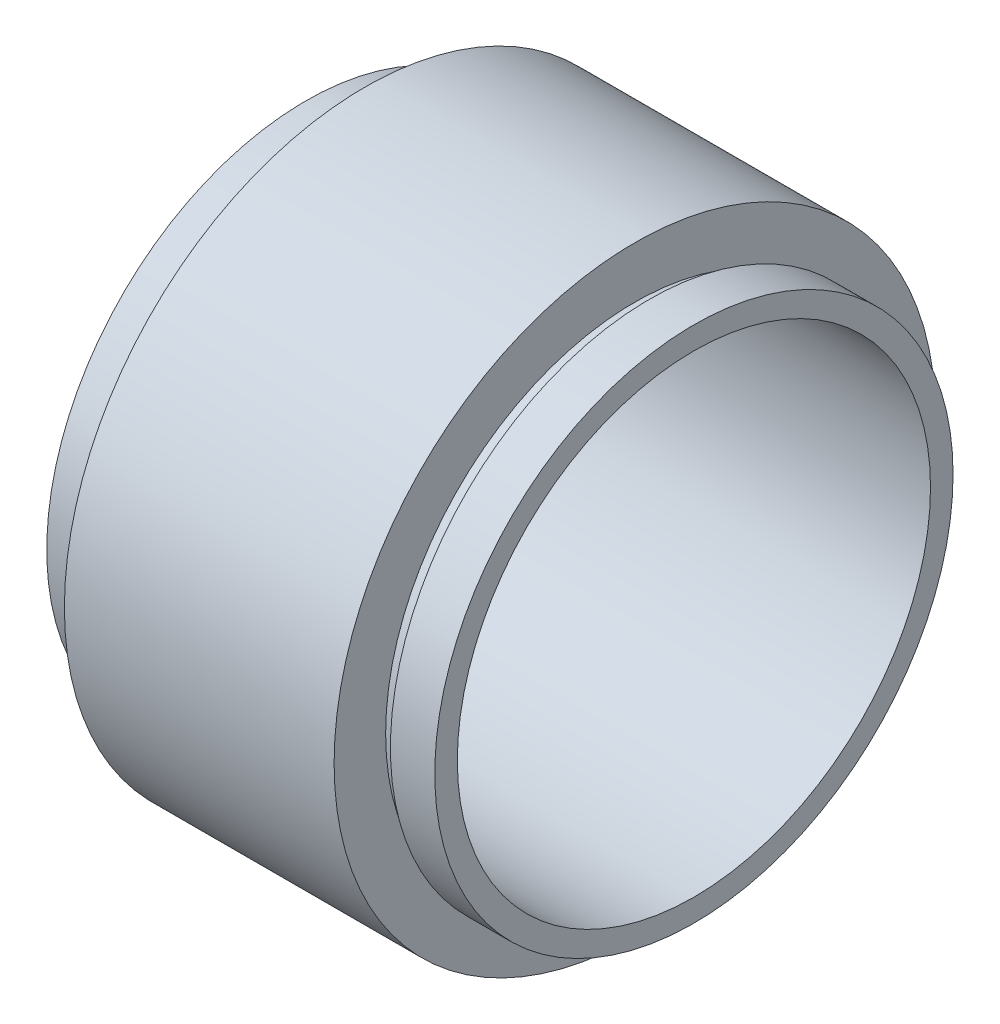
ISO-10303-21;
HEADER;
FILE_DESCRIPTION(('STEP AP214'),'2;1');
FILE_NAME('part.step','',(''),(''),'','','');
FILE_SCHEMA(('AUTOMOTIVE_DESIGN { 1 0 10303 214 1 1 1 1 }'));
ENDSEC;
DATA;
#1=APPLICATION_CONTEXT('core data for automotive mechanical design processes');
#2=APPLICATION_PROTOCOL_DEFINITION('international standard','automotive_design',2000,#1);
#3=PRODUCT_CONTEXT('',#1,'mechanical');
#4=PRODUCT('Part','Part','',(#3));
#5=PRODUCT_RELATED_PRODUCT_CATEGORY('part','',(#4));
#6=PRODUCT_DEFINITION_FORMATION('','',#4);
#7=PRODUCT_DEFINITION_CONTEXT('part definition',#1,'design');
#8=PRODUCT_DEFINITION('design','',#6,#7);
#9=PRODUCT_DEFINITION_SHAPE('','',#8);
#10=(LENGTH_UNIT() NAMED_UNIT(*) SI_UNIT(.MILLI.,.METRE.));
#11=(NAMED_UNIT(*) PLANE_ANGLE_UNIT() SI_UNIT($,.RADIAN.));
#12=(NAMED_UNIT(*) SI_UNIT($,.STERADIAN.) SOLID_ANGLE_UNIT());
#13=UNCERTAINTY_MEASURE_WITH_UNIT(LENGTH_MEASURE(1.E-05),#10,'distance_accuracy_value','');
#14=(GEOMETRIC_REPRESENTATION_CONTEXT(3) GLOBAL_UNCERTAINTY_ASSIGNED_CONTEXT((#13)) GLOBAL_UNIT_ASSIGNED_CONTEXT((#10,
#11,#12)) REPRESENTATION_CONTEXT('',''));
#15=CARTESIAN_POINT('',(0.,0.,0.));
#16=DIRECTION('',(0.,0.,1.));
#17=DIRECTION('',(1.,0.,0.));
#18=AXIS2_PLACEMENT_3D('',#15,#16,#17);
#19=CARTESIAN_POINT('',(9.84,13.1445,0.));
#20=DIRECTION('',(1.,0.,0.));
#21=DIRECTION('',(0.,0.,-1.));
#22=AXIS2_PLACEMENT_3D('',#19,#20,#21);
#23=PLANE('',#22);
#24=CARTESIAN_POINT('',(9.84,0.,0.));
#25=DIRECTION('',(-1.,0.,0.));
#26=DIRECTION('',(0.,-1.,0.));
#27=AXIS2_PLACEMENT_3D('',#24,#25,#26);
#28=CIRCLE('',#27,12.);
#29=CARTESIAN_POINT('',(9.84,-12.,0.));
#30=VERTEX_POINT('',#29);
#31=EDGE_CURVE('E71',#30,#30,#28,.T.);
#32=ORIENTED_EDGE('',*,*,#31,.T.);
#33=EDGE_LOOP('',(#32));
#34=FACE_BOUND('',#33,.T.);
#35=CARTESIAN_POINT('',(9.84,0.,0.));
#36=DIRECTION('',(1.,0.,0.));
#37=DIRECTION('',(0.,0.,-1.));
#38=AXIS2_PLACEMENT_3D('',#35,#36,#37);
#39=CIRCLE('',#38,13.1445);
#40=CARTESIAN_POINT('',(9.84,0.,-13.1445));
#41=VERTEX_POINT('',#40);
#42=EDGE_CURVE('E68',#41,#41,#39,.T.);
#43=ORIENTED_EDGE('',*,*,#42,.T.);
#44=EDGE_LOOP('',(#43));
#45=FACE_BOUND('',#44,.T.);
#46=ADVANCED_FACE('F34',(#34,#45),#23,.T.);
#47=CARTESIAN_POINT('',(-9.84,0.,0.));
#48=DIRECTION('',(-1.,0.,0.));
#49=DIRECTION('',(0.,0.,1.));
#50=AXIS2_PLACEMENT_3D('',#47,#48,#49);
#51=PLANE('',#50);
#52=CARTESIAN_POINT('',(-9.84,0.,0.));
#53=DIRECTION('',(-1.,0.,0.));
#54=DIRECTION('',(0.,-1.,0.));
#55=AXIS2_PLACEMENT_3D('',#52,#53,#54);
#56=CIRCLE('',#55,12.);
#57=CARTESIAN_POINT('',(-9.84,-12.,0.));
#58=VERTEX_POINT('',#57);
#59=EDGE_CURVE('E72',#58,#58,#56,.T.);
#60=ORIENTED_EDGE('',*,*,#59,.F.);
#61=EDGE_LOOP('',(#60));
#62=FACE_BOUND('',#61,.T.);
#63=CARTESIAN_POINT('',(-9.84,0.,0.));
#64=DIRECTION('',(1.,0.,0.));
#65=DIRECTION('',(0.,0.,-1.));
#66=AXIS2_PLACEMENT_3D('',#63,#64,#65);
#67=CIRCLE('',#66,13.1445);
#68=CARTESIAN_POINT('',(-9.84,0.,-13.1445));
#69=VERTEX_POINT('',#68);
#70=EDGE_CURVE('E10',#69,#69,#67,.T.);
#71=ORIENTED_EDGE('',*,*,#70,.F.);
#72=EDGE_LOOP('',(#71));
#73=FACE_BOUND('',#72,.T.);
#74=ADVANCED_FACE('F87',(#62,#73),#51,.T.);
#75=CARTESIAN_POINT('',(9.84,0.,0.));
#76=DIRECTION('',(1.,0.,0.));
#77=DIRECTION('',(0.,0.,-1.));
#78=AXIS2_PLACEMENT_3D('',#75,#76,#77);
#79=CYLINDRICAL_SURFACE('',#78,13.1445);
#80=ORIENTED_EDGE('',*,*,#70,.T.);
#81=EDGE_LOOP('',(#80));
#82=FACE_BOUND('',#81,.T.);
#83=CARTESIAN_POINT('',(-7.59,0.,0.));
#84=DIRECTION('',(1.,0.,0.));
#85=DIRECTION('',(0.,0.,-1.));
#86=AXIS2_PLACEMENT_3D('',#83,#84,#85);
#87=CIRCLE('',#86,13.1445);
#88=CARTESIAN_POINT('',(-7.59,0.,-13.1445));
#89=VERTEX_POINT('',#88);
#90=EDGE_CURVE('E40',#89,#89,#87,.T.);
#91=ORIENTED_EDGE('',*,*,#90,.F.);
#92=EDGE_LOOP('',(#91));
#93=FACE_BOUND('',#92,.T.);
#94=ADVANCED_FACE('F90',(#82,#93),#79,.T.);
#95=CARTESIAN_POINT('',(-7.59,13.1445,0.));
#96=DIRECTION('',(1.,0.,0.));
#97=DIRECTION('',(0.,0.,-1.));
#98=AXIS2_PLACEMENT_3D('',#95,#96,#97);
#99=PLANE('',#98);
#100=ORIENTED_EDGE('',*,*,#90,.T.);
#101=EDGE_LOOP('',(#100));
#102=FACE_BOUND('',#101,.T.);
#103=CARTESIAN_POINT('',(-7.59,0.,0.));
#104=DIRECTION('',(1.,0.,0.));
#105=DIRECTION('',(0.,0.,-1.));
#106=AXIS2_PLACEMENT_3D('',#103,#104,#105);
#107=CIRCLE('',#106,12.6365);
#108=CARTESIAN_POINT('',(-7.59,0.,-12.6365));
#109=VERTEX_POINT('',#108);
#110=EDGE_CURVE('E44',#109,#109,#107,.T.);
#111=ORIENTED_EDGE('',*,*,#110,.F.);
#112=EDGE_LOOP('',(#111));
#113=FACE_BOUND('',#112,.T.);
#114=ADVANCED_FACE('F95',(#102,#113),#99,.T.);
#115=CARTESIAN_POINT('',(9.84,0.,0.));
#116=DIRECTION('',(1.,0.,0.));
#117=DIRECTION('',(0.,0.,-1.));
#118=AXIS2_PLACEMENT_3D('',#115,#116,#117);
#119=CYLINDRICAL_SURFACE('',#118,12.6365);
#120=ORIENTED_EDGE('',*,*,#110,.T.);
#121=EDGE_LOOP('',(#120));
#122=FACE_BOUND('',#121,.T.);
#123=CARTESIAN_POINT('',(-6.84,0.,0.));
#124=DIRECTION('',(1.,0.,0.));
#125=DIRECTION('',(0.,0.,-1.));
#126=AXIS2_PLACEMENT_3D('',#123,#124,#125);
#127=CIRCLE('',#126,12.6365);
#128=CARTESIAN_POINT('',(-6.84,0.,-12.6365));
#129=VERTEX_POINT('',#128);
#130=EDGE_CURVE('E48',#129,#129,#127,.T.);
#131=ORIENTED_EDGE('',*,*,#130,.F.);
#132=EDGE_LOOP('',(#131));
#133=FACE_BOUND('',#132,.T.);
#134=ADVANCED_FACE('F100',(#122,#133),#119,.T.);
#135=CARTESIAN_POINT('',(-6.84,12.6365,0.));
#136=DIRECTION('',(-1.,0.,0.));
#137=DIRECTION('',(0.,0.,1.));
#138=AXIS2_PLACEMENT_3D('',#135,#136,#137);
#139=PLANE('',#138);
#140=ORIENTED_EDGE('',*,*,#130,.T.);
#141=EDGE_LOOP('',(#140));
#142=FACE_BOUND('',#141,.T.);
#143=CARTESIAN_POINT('',(-6.84,0.,0.));
#144=DIRECTION('',(1.,0.,0.));
#145=DIRECTION('',(0.,0.,-1.));
#146=AXIS2_PLACEMENT_3D('',#143,#144,#145);
#147=CIRCLE('',#146,15.25);
#148=CARTESIAN_POINT('',(-6.84,0.,-15.25));
#149=VERTEX_POINT('',#148);
#150=EDGE_CURVE('E53',#149,#149,#147,.T.);
#151=ORIENTED_EDGE('',*,*,#150,.F.);
#152=EDGE_LOOP('',(#151));
#153=FACE_BOUND('',#152,.T.);
#154=ADVANCED_FACE('F103',(#142,#153),#139,.T.);
#155=CARTESIAN_POINT('',(9.84,0.,0.));
#156=DIRECTION('',(1.,0.,0.));
#157=DIRECTION('',(0.,0.,-1.));
#158=AXIS2_PLACEMENT_3D('',#155,#156,#157);
#159=CYLINDRICAL_SURFACE('',#158,15.25);
#160=ORIENTED_EDGE('',*,*,#150,.T.);
#161=EDGE_LOOP('',(#160));
#162=FACE_BOUND('',#161,.T.);
#163=CARTESIAN_POINT('',(6.84,0.,0.));
#164=DIRECTION('',(1.,0.,0.));
#165=DIRECTION('',(0.,0.,-1.));
#166=AXIS2_PLACEMENT_3D('',#163,#164,#165);
#167=CIRCLE('',#166,15.25);
#168=CARTESIAN_POINT('',(6.84,0.,-15.25));
#169=VERTEX_POINT('',#168);
#170=EDGE_CURVE('E56',#169,#169,#167,.T.);
#171=ORIENTED_EDGE('',*,*,#170,.F.);
#172=EDGE_LOOP('',(#171));
#173=FACE_BOUND('',#172,.T.);
#174=ADVANCED_FACE('F107',(#162,#173),#159,.T.);
#175=CARTESIAN_POINT('',(6.84,15.25,0.));
#176=DIRECTION('',(1.,0.,0.));
#177=DIRECTION('',(0.,0.,-1.));
#178=AXIS2_PLACEMENT_3D('',#175,#176,#177);
#179=PLANE('',#178);
#180=ORIENTED_EDGE('',*,*,#170,.T.);
#181=EDGE_LOOP('',(#180));
#182=FACE_BOUND('',#181,.T.);
#183=CARTESIAN_POINT('',(6.84,0.,0.));
#184=DIRECTION('',(1.,0.,0.));
#185=DIRECTION('',(0.,0.,-1.));
#186=AXIS2_PLACEMENT_3D('',#183,#184,#185);
#187=CIRCLE('',#186,12.6365);
#188=CARTESIAN_POINT('',(6.84,0.,-12.6365));
#189=VERTEX_POINT('',#188);
#190=EDGE_CURVE('E59',#189,#189,#187,.T.);
#191=ORIENTED_EDGE('',*,*,#190,.F.);
#192=EDGE_LOOP('',(#191));
#193=FACE_BOUND('',#192,.T.);
#194=ADVANCED_FACE('F111',(#182,#193),#179,.T.);
#195=CARTESIAN_POINT('',(9.84,0.,0.));
#196=DIRECTION('',(1.,0.,0.));
#197=DIRECTION('',(0.,0.,-1.));
#198=AXIS2_PLACEMENT_3D('',#195,#196,#197);
#199=CYLINDRICAL_SURFACE('',#198,12.6365);
#200=ORIENTED_EDGE('',*,*,#190,.T.);
#201=EDGE_LOOP('',(#200));
#202=FACE_BOUND('',#201,.T.);
#203=CARTESIAN_POINT('',(7.59,0.,0.));
#204=DIRECTION('',(1.,0.,0.));
#205=DIRECTION('',(0.,0.,-1.));
#206=AXIS2_PLACEMENT_3D('',#203,#204,#205);
#207=CIRCLE('',#206,12.6365);
#208=CARTESIAN_POINT('',(7.59,0.,-12.6365));
#209=VERTEX_POINT('',#208);
#210=EDGE_CURVE('E62',#209,#209,#207,.T.);
#211=ORIENTED_EDGE('',*,*,#210,.F.);
#212=EDGE_LOOP('',(#211));
#213=FACE_BOUND('',#212,.T.);
#214=ADVANCED_FACE('F115',(#202,#213),#199,.T.);
#215=CARTESIAN_POINT('',(7.59,12.6365,0.));
#216=DIRECTION('',(-1.,0.,0.));
#217=DIRECTION('',(0.,0.,1.));
#218=AXIS2_PLACEMENT_3D('',#215,#216,#217);
#219=PLANE('',#218);
#220=ORIENTED_EDGE('',*,*,#210,.T.);
#221=EDGE_LOOP('',(#220));
#222=FACE_BOUND('',#221,.T.);
#223=CARTESIAN_POINT('',(7.59,0.,0.));
#224=DIRECTION('',(1.,0.,0.));
#225=DIRECTION('',(0.,0.,-1.));
#226=AXIS2_PLACEMENT_3D('',#223,#224,#225);
#227=CIRCLE('',#226,13.1445);
#228=CARTESIAN_POINT('',(7.59,0.,-13.1445));
#229=VERTEX_POINT('',#228);
#230=EDGE_CURVE('E65',#229,#229,#227,.T.);
#231=ORIENTED_EDGE('',*,*,#230,.F.);
#232=EDGE_LOOP('',(#231));
#233=FACE_BOUND('',#232,.T.);
#234=ADVANCED_FACE('F119',(#222,#233),#219,.T.);
#235=CARTESIAN_POINT('',(9.84,0.,0.));
#236=DIRECTION('',(1.,0.,0.));
#237=DIRECTION('',(0.,0.,-1.));
#238=AXIS2_PLACEMENT_3D('',#235,#236,#237);
#239=CYLINDRICAL_SURFACE('',#238,13.1445);
#240=ORIENTED_EDGE('',*,*,#230,.T.);
#241=EDGE_LOOP('',(#240));
#242=FACE_BOUND('',#241,.T.);
#243=ORIENTED_EDGE('',*,*,#42,.F.);
#244=EDGE_LOOP('',(#243));
#245=FACE_BOUND('',#244,.T.);
#246=ADVANCED_FACE('F83',(#242,#245),#239,.T.);
#247=CARTESIAN_POINT('',(9.84,0.,0.));
#248=DIRECTION('',(-1.,0.,0.));
#249=DIRECTION('',(0.,-1.,0.));
#250=AXIS2_PLACEMENT_3D('',#247,#248,#249);
#251=CYLINDRICAL_SURFACE('',#250,12.);
#252=CARTESIAN_POINT('',(9.84,-12.,0.));
#253=CARTESIAN_POINT('',(9.635,-12.,0.));
#254=CARTESIAN_POINT('',(9.43,-12.,0.));
#255=CARTESIAN_POINT('',(9.02,-12.,0.));
#256=CARTESIAN_POINT('',(8.815,-12.,0.));
#257=CARTESIAN_POINT('',(8.405,-12.,0.));
#258=CARTESIAN_POINT('',(8.2,-12.,0.));
#259=CARTESIAN_POINT('',(7.79,-12.,0.));
#260=CARTESIAN_POINT('',(7.585,-12.,0.));
#261=CARTESIAN_POINT('',(7.175,-12.,0.));
#262=CARTESIAN_POINT('',(6.97,-12.,0.));
#263=CARTESIAN_POINT('',(6.56,-12.,0.));
#264=CARTESIAN_POINT('',(6.355,-12.,0.));
#265=CARTESIAN_POINT('',(5.945,-12.,0.));
#266=CARTESIAN_POINT('',(5.74,-12.,0.));
#267=CARTESIAN_POINT('',(5.33,-12.,0.));
#268=CARTESIAN_POINT('',(5.125,-12.,0.));
#269=CARTESIAN_POINT('',(4.715,-12.,0.));
#270=CARTESIAN_POINT('',(4.51,-12.,0.));
#271=CARTESIAN_POINT('',(4.1,-12.,0.));
#272=CARTESIAN_POINT('',(3.895,-12.,0.));
#273=CARTESIAN_POINT('',(3.485,-12.,0.));
#274=CARTESIAN_POINT('',(3.28,-12.,0.));
#275=CARTESIAN_POINT('',(2.87,-12.,0.));
#276=CARTESIAN_POINT('',(2.665,-12.,0.));
#277=CARTESIAN_POINT('',(2.255,-12.,0.));
#278=CARTESIAN_POINT('',(2.05,-12.,0.));
#279=CARTESIAN_POINT('',(1.64,-12.,0.));
#280=CARTESIAN_POINT('',(1.435,-12.,0.));
#281=CARTESIAN_POINT('',(1.025,-12.,0.));
#282=CARTESIAN_POINT('',(0.819999999999997,-12.,0.));
#283=CARTESIAN_POINT('',(0.409999999999997,-12.,0.));
#284=CARTESIAN_POINT('',(0.204999999999997,-12.,0.));
#285=CARTESIAN_POINT('',(-0.205000000000004,-12.,0.));
#286=CARTESIAN_POINT('',(-0.410000000000004,-12.,0.));
#287=CARTESIAN_POINT('',(-0.820000000000004,-12.,0.));
#288=CARTESIAN_POINT('',(-1.025,-12.,0.));
#289=CARTESIAN_POINT('',(-1.435,-12.,0.));
#290=CARTESIAN_POINT('',(-1.64,-12.,0.));
#291=CARTESIAN_POINT('',(-2.05,-12.,0.));
#292=CARTESIAN_POINT('',(-2.255,-12.,0.));
#293=CARTESIAN_POINT('',(-2.665,-12.,0.));
#294=CARTESIAN_POINT('',(-2.87,-12.,0.));
#295=CARTESIAN_POINT('',(-3.28,-12.,0.));
#296=CARTESIAN_POINT('',(-3.485,-12.,0.));
#297=CARTESIAN_POINT('',(-3.895,-12.,0.));
#298=CARTESIAN_POINT('',(-4.1,-12.,0.));
#299=CARTESIAN_POINT('',(-4.51,-12.,0.));
#300=CARTESIAN_POINT('',(-4.715,-12.,0.));
#301=CARTESIAN_POINT('',(-5.125,-12.,0.));
#302=CARTESIAN_POINT('',(-5.33,-12.,0.));
#303=CARTESIAN_POINT('',(-5.74,-12.,0.));
#304=CARTESIAN_POINT('',(-5.945,-12.,0.));
#305=CARTESIAN_POINT('',(-6.355,-12.,0.));
#306=CARTESIAN_POINT('',(-6.56,-12.,0.));
#307=CARTESIAN_POINT('',(-6.97,-12.,0.));
#308=CARTESIAN_POINT('',(-7.175,-12.,0.));
#309=CARTESIAN_POINT('',(-7.585,-12.,0.));
#310=CARTESIAN_POINT('',(-7.79,-12.,0.));
#311=CARTESIAN_POINT('',(-8.2,-12.,0.));
#312=CARTESIAN_POINT('',(-8.405,-12.,0.));
#313=CARTESIAN_POINT('',(-8.815,-12.,0.));
#314=CARTESIAN_POINT('',(-9.02,-12.,0.));
#315=CARTESIAN_POINT('',(-9.43,-12.,0.));
#316=CARTESIAN_POINT('',(-9.635,-12.,0.));
#317=CARTESIAN_POINT('',(-9.84,-12.,0.));
#318=B_SPLINE_CURVE_WITH_KNOTS('',3,(#252,#253,#254,#255,#256,#257,#258,#259,#260,#261,#262,
#263,#264,#265,#266,#267,#268,#269,#270,#271,#272,#273,#274,#275,#276,#277,#278,#279,#280,#281,
#282,#283,#284,#285,#286,#287,#288,#289,#290,#291,#292,#293,#294,#295,#296,#297,#298,#299,#300,
#301,#302,#303,#304,#305,#306,#307,#308,#309,#310,#311,#312,#313,#314,#315,#316,#317),
.UNSPECIFIED.,.F.,.F.,(4,2,2,2,2,2,2,2,2,2,2,2,2,2,2,2,2,2,2,2,2,2,2,2,2,2,2,2,2,2,2,2,4),(0.,
0.614999999999999,1.23,1.845,2.46,3.075,3.69,4.305,4.92,5.535,6.15,6.765,7.38,7.995,8.61,9.225,
9.84,10.455,11.07,11.685,12.3,12.915,13.53,14.145,14.76,15.375,15.99,16.605,17.22,17.835,18.45,
19.065,19.68),.UNSPECIFIED.);
#319=EDGE_CURVE('BSEAM80',#30,#58,#318,.T.);
#320=ORIENTED_EDGE('',*,*,#31,.F.);
#321=ORIENTED_EDGE('',*,*,#59,.T.);
#322=ORIENTED_EDGE('',*,*,#319,.T.);
#323=ORIENTED_EDGE('',*,*,#319,.F.);
#324=EDGE_LOOP('',(#320,#322,#321,#323));
#325=FACE_BOUND('',#324,.T.);
#326=ADVANCED_FACE('F80',(#325),#251,.F.);
#327=CLOSED_SHELL('',(#46,#74,#94,#114,#134,#154,#174,#194,#214,#234,#246,#326));
#328=MANIFOLD_SOLID_BREP('B2',#327);
#329=ADVANCED_BREP_SHAPE_REPRESENTATION('',(#18,#328),#14);
#330=SHAPE_DEFINITION_REPRESENTATION(#9,#329);
ENDSEC;
END-ISO-10303-21;
